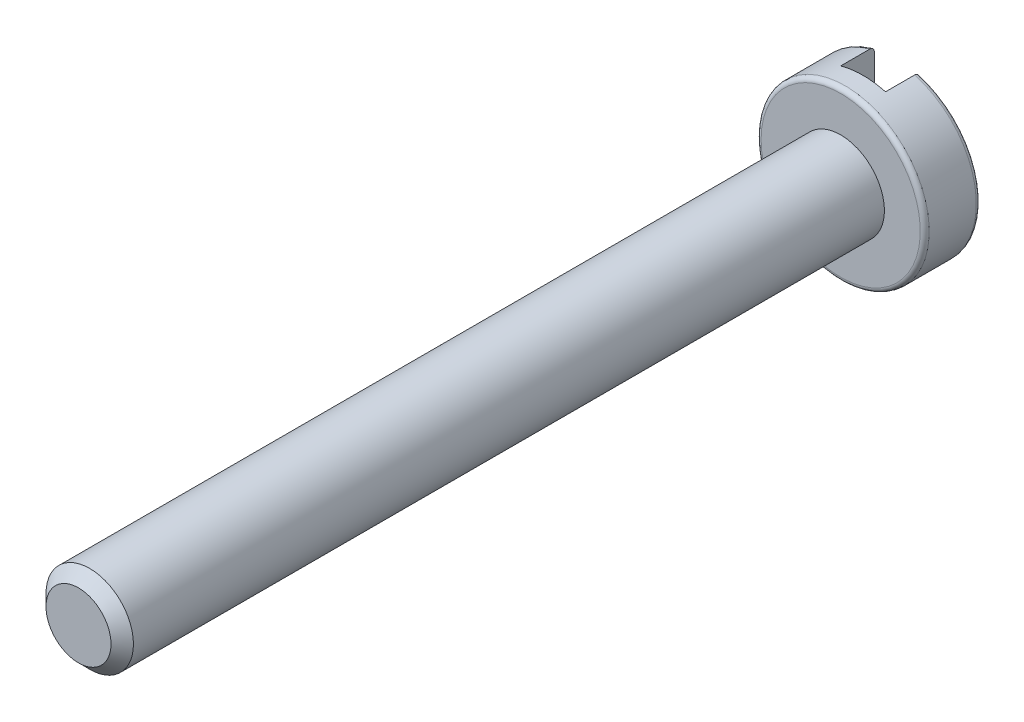
ISO-10303-21;
HEADER;
FILE_DESCRIPTION(('STEP AP214'),'2;1');
FILE_NAME('part.step','',(''),(''),'','','');
FILE_SCHEMA(('AUTOMOTIVE_DESIGN { 1 0 10303 214 1 1 1 1 }'));
ENDSEC;
DATA;
#1=APPLICATION_CONTEXT('core data for automotive mechanical design processes');
#2=APPLICATION_PROTOCOL_DEFINITION('international standard','automotive_design',2000,#1);
#3=PRODUCT_CONTEXT('',#1,'mechanical');
#4=PRODUCT('Part','Part','',(#3));
#5=PRODUCT_RELATED_PRODUCT_CATEGORY('part','',(#4));
#6=PRODUCT_DEFINITION_FORMATION('','',#4);
#7=PRODUCT_DEFINITION_CONTEXT('part definition',#1,'design');
#8=PRODUCT_DEFINITION('design','',#6,#7);
#9=PRODUCT_DEFINITION_SHAPE('','',#8);
#10=(LENGTH_UNIT() NAMED_UNIT(*) SI_UNIT(.MILLI.,.METRE.));
#11=(NAMED_UNIT(*) PLANE_ANGLE_UNIT() SI_UNIT($,.RADIAN.));
#12=(NAMED_UNIT(*) SI_UNIT($,.STERADIAN.) SOLID_ANGLE_UNIT());
#13=UNCERTAINTY_MEASURE_WITH_UNIT(LENGTH_MEASURE(1.E-05),#10,'distance_accuracy_value','');
#14=(GEOMETRIC_REPRESENTATION_CONTEXT(3) GLOBAL_UNCERTAINTY_ASSIGNED_CONTEXT((#13)) GLOBAL_UNIT_ASSIGNED_CONTEXT((#10,
#11,#12)) REPRESENTATION_CONTEXT('',''));
#15=CARTESIAN_POINT('',(0.,0.,0.));
#16=DIRECTION('',(0.,0.,1.));
#17=DIRECTION('',(1.,0.,0.));
#18=AXIS2_PLACEMENT_3D('',#15,#16,#17);
#19=CARTESIAN_POINT('',(0.,0.,-2.5));
#20=DIRECTION('',(0.,0.,-1.));
#21=DIRECTION('',(-1.,0.,0.));
#22=AXIS2_PLACEMENT_3D('',#19,#20,#21);
#23=PLANE('',#22);
#24=DIRECTION('',(0.,-1.,0.));
#25=VECTOR('',#24,1.);
#26=CARTESIAN_POINT('',(1.,0.,-2.5));
#27=LINE('',#26,#25);
#28=CARTESIAN_POINT('',(1.,3.40624426605022,-2.5));
#29=VERTEX_POINT('',#28);
#30=CARTESIAN_POINT('',(1.,-3.40624426605022,-2.5));
#31=VERTEX_POINT('',#30);
#32=EDGE_CURVE('E114',#29,#31,#27,.T.);
#33=ORIENTED_EDGE('',*,*,#32,.F.);
#34=CARTESIAN_POINT('',(0.,0.,-2.5));
#35=DIRECTION('',(0.,0.,-1.));
#36=DIRECTION('',(-1.,0.,0.));
#37=AXIS2_PLACEMENT_3D('',#34,#35,#36);
#38=CIRCLE('',#37,3.55);
#39=EDGE_CURVE('E210',#29,#31,#38,.T.);
#40=ORIENTED_EDGE('',*,*,#39,.T.);
#41=EDGE_LOOP('',(#33,#40));
#42=FACE_BOUND('',#41,.T.);
#43=ADVANCED_FACE('F34',(#42),#23,.T.);
#44=CARTESIAN_POINT('',(0.,0.,34.));
#45=DIRECTION('',(0.,0.,-1.));
#46=DIRECTION('',(-1.,0.,0.));
#47=AXIS2_PLACEMENT_3D('',#44,#45,#46);
#48=CYLINDRICAL_SURFACE('',#47,1.95);
#49=CARTESIAN_POINT('',(0.,0.,33.5));
#50=DIRECTION('',(0.,0.,1.));
#51=DIRECTION('',(1.,0.,0.));
#52=AXIS2_PLACEMENT_3D('',#49,#50,#51);
#53=CIRCLE('',#52,1.95);
#54=CARTESIAN_POINT('',(1.95,0.,33.5));
#55=VERTEX_POINT('',#54);
#56=EDGE_CURVE('E11',#55,#55,#53,.F.);
#57=ORIENTED_EDGE('',*,*,#56,.T.);
#58=EDGE_LOOP('',(#57));
#59=FACE_BOUND('',#58,.T.);
#60=CARTESIAN_POINT('',(0.,0.,0.));
#61=DIRECTION('',(0.,0.,-1.));
#62=DIRECTION('',(-1.,0.,0.));
#63=AXIS2_PLACEMENT_3D('',#60,#61,#62);
#64=CIRCLE('',#63,1.95);
#65=CARTESIAN_POINT('',(-1.95,0.,0.));
#66=VERTEX_POINT('',#65);
#67=EDGE_CURVE('E125',#66,#66,#64,.T.);
#68=ORIENTED_EDGE('',*,*,#67,.F.);
#69=EDGE_LOOP('',(#68));
#70=FACE_BOUND('',#69,.T.);
#71=ADVANCED_FACE('F190',(#59,#70),#48,.T.);
#72=CARTESIAN_POINT('',(0.,0.,34.));
#73=DIRECTION('',(0.,0.,1.));
#74=DIRECTION('',(1.,0.,0.));
#75=AXIS2_PLACEMENT_3D('',#72,#73,#74);
#76=PLANE('',#75);
#77=CARTESIAN_POINT('',(0.,0.,34.));
#78=DIRECTION('',(0.,0.,1.));
#79=DIRECTION('',(1.,0.,0.));
#80=AXIS2_PLACEMENT_3D('',#77,#78,#79);
#81=CIRCLE('',#80,1.45);
#82=CARTESIAN_POINT('',(1.45,0.,34.));
#83=VERTEX_POINT('',#82);
#84=EDGE_CURVE('E42',#83,#83,#81,.T.);
#85=ORIENTED_EDGE('',*,*,#84,.T.);
#86=EDGE_LOOP('',(#85));
#87=FACE_BOUND('',#86,.T.);
#88=ADVANCED_FACE('F195',(#87),#76,.T.);
#89=CARTESIAN_POINT('',(0.,0.,-2.5));
#90=DIRECTION('',(0.,0.,1.));
#91=DIRECTION('',(1.,0.,0.));
#92=AXIS2_PLACEMENT_3D('',#89,#90,#91);
#93=CYLINDRICAL_SURFACE('',#92,3.75);
#94=CARTESIAN_POINT('',(0.,0.,-0.2));
#95=DIRECTION('',(0.,0.,-1.));
#96=DIRECTION('',(-1.,0.,0.));
#97=AXIS2_PLACEMENT_3D('',#94,#95,#96);
#98=CIRCLE('',#97,3.75);
#99=CARTESIAN_POINT('',(-3.75,0.,-0.2));
#100=VERTEX_POINT('',#99);
#101=EDGE_CURVE('E134',#100,#100,#98,.T.);
#102=ORIENTED_EDGE('',*,*,#101,.T.);
#103=EDGE_LOOP('',(#102));
#104=FACE_BOUND('',#103,.T.);
#105=DIRECTION('',(0.,0.,1.));
#106=VECTOR('',#105,1.);
#107=CARTESIAN_POINT('',(-1.,3.61420807370024,-2.5));
#108=LINE('',#107,#106);
#109=CARTESIAN_POINT('',(-1.,3.61420807370024,-1.));
#110=VERTEX_POINT('',#109);
#111=CARTESIAN_POINT('',(-1.,3.61420807370024,-2.3));
#112=VERTEX_POINT('',#111);
#113=EDGE_CURVE('E102',#110,#112,#108,.F.);
#114=ORIENTED_EDGE('',*,*,#113,.T.);
#115=CARTESIAN_POINT('',(0.,0.,-2.3));
#116=DIRECTION('',(0.,0.,-1.));
#117=DIRECTION('',(-1.,0.,0.));
#118=AXIS2_PLACEMENT_3D('',#115,#116,#117);
#119=CIRCLE('',#118,3.75);
#120=CARTESIAN_POINT('',(-1.00000000000001,-3.61420807370024,-2.3));
#121=VERTEX_POINT('',#120);
#122=EDGE_CURVE('E97',#112,#121,#119,.F.);
#123=ORIENTED_EDGE('',*,*,#122,.T.);
#124=DIRECTION('',(0.,0.,1.));
#125=VECTOR('',#124,1.);
#126=CARTESIAN_POINT('',(-1.00000000000001,-3.61420807370024,-2.5));
#127=LINE('',#126,#125);
#128=CARTESIAN_POINT('',(-1.00000000000001,-3.61420807370024,-1.));
#129=VERTEX_POINT('',#128);
#130=EDGE_CURVE('E90',#121,#129,#127,.T.);
#131=ORIENTED_EDGE('',*,*,#130,.T.);
#132=CARTESIAN_POINT('',(0.,0.,-1.));
#133=DIRECTION('',(0.,0.,-1.));
#134=DIRECTION('',(-1.,0.,0.));
#135=AXIS2_PLACEMENT_3D('',#132,#133,#134);
#136=CIRCLE('',#135,3.75);
#137=CARTESIAN_POINT('',(1.,-3.61420807370024,-1.));
#138=VERTEX_POINT('',#137);
#139=EDGE_CURVE('E95',#138,#129,#136,.T.);
#140=ORIENTED_EDGE('',*,*,#139,.F.);
#141=DIRECTION('',(0.,0.,1.));
#142=VECTOR('',#141,1.);
#143=CARTESIAN_POINT('',(1.,-3.61420807370024,-2.5));
#144=LINE('',#143,#142);
#145=CARTESIAN_POINT('',(1.,-3.61420807370024,-2.3));
#146=VERTEX_POINT('',#145);
#147=EDGE_CURVE('E101',#138,#146,#144,.F.);
#148=ORIENTED_EDGE('',*,*,#147,.T.);
#149=CARTESIAN_POINT('',(0.,0.,-2.3));
#150=DIRECTION('',(0.,0.,-1.));
#151=DIRECTION('',(-1.,0.,0.));
#152=AXIS2_PLACEMENT_3D('',#149,#150,#151);
#153=CIRCLE('',#152,3.75);
#154=CARTESIAN_POINT('',(1.,3.61420807370024,-2.3));
#155=VERTEX_POINT('',#154);
#156=EDGE_CURVE('E131',#146,#155,#153,.F.);
#157=ORIENTED_EDGE('',*,*,#156,.T.);
#158=DIRECTION('',(0.,0.,1.));
#159=VECTOR('',#158,1.);
#160=CARTESIAN_POINT('',(1.,3.61420807370024,-2.5));
#161=LINE('',#160,#159);
#162=CARTESIAN_POINT('',(1.,3.61420807370024,-1.));
#163=VERTEX_POINT('',#162);
#164=EDGE_CURVE('E123',#155,#163,#161,.T.);
#165=ORIENTED_EDGE('',*,*,#164,.T.);
#166=EDGE_CURVE('E113',#110,#163,#136,.T.);
#167=ORIENTED_EDGE('',*,*,#166,.F.);
#168=EDGE_LOOP('',(#114,#123,#131,#140,#148,#157,#165,#167));
#169=FACE_BOUND('',#168,.T.);
#170=ADVANCED_FACE('F93',(#104,#169),#93,.T.);
#171=DIRECTION('',(0.,1.,0.));
#172=VECTOR('',#171,1.);
#173=CARTESIAN_POINT('',(-1.,0.,-2.5));
#174=LINE('',#173,#172);
#175=CARTESIAN_POINT('',(-1.,-3.40624426605022,-2.5));
#176=VERTEX_POINT('',#175);
#177=CARTESIAN_POINT('',(-1.,3.40624426605022,-2.5));
#178=VERTEX_POINT('',#177);
#179=EDGE_CURVE('E128',#176,#178,#174,.T.);
#180=ORIENTED_EDGE('',*,*,#179,.F.);
#181=CARTESIAN_POINT('',(0.,0.,-2.5));
#182=DIRECTION('',(0.,0.,-1.));
#183=DIRECTION('',(-1.,0.,0.));
#184=AXIS2_PLACEMENT_3D('',#181,#182,#183);
#185=CIRCLE('',#184,3.55);
#186=EDGE_CURVE('E140',#176,#178,#185,.T.);
#187=ORIENTED_EDGE('',*,*,#186,.T.);
#188=EDGE_LOOP('',(#180,#187));
#189=FACE_BOUND('',#188,.T.);
#190=ADVANCED_FACE('F168',(#189),#23,.T.);
#191=CARTESIAN_POINT('',(0.,0.,0.));
#192=DIRECTION('',(0.,0.,-1.));
#193=DIRECTION('',(-1.,0.,0.));
#194=AXIS2_PLACEMENT_3D('',#191,#192,#193);
#195=PLANE('',#194);
#196=CARTESIAN_POINT('',(0.,0.,0.));
#197=DIRECTION('',(0.,0.,-1.));
#198=DIRECTION('',(-1.,0.,0.));
#199=AXIS2_PLACEMENT_3D('',#196,#197,#198);
#200=CIRCLE('',#199,3.55);
#201=CARTESIAN_POINT('',(-3.55,0.,0.));
#202=VERTEX_POINT('',#201);
#203=EDGE_CURVE('E137',#202,#202,#200,.F.);
#204=ORIENTED_EDGE('',*,*,#203,.T.);
#205=EDGE_LOOP('',(#204));
#206=FACE_BOUND('',#205,.T.);
#207=ORIENTED_EDGE('',*,*,#67,.T.);
#208=EDGE_LOOP('',(#207));
#209=FACE_BOUND('',#208,.T.);
#210=ADVANCED_FACE('F199',(#206,#209),#195,.F.);
#211=CARTESIAN_POINT('',(0.,0.,-1.));
#212=DIRECTION('',(0.,0.,-1.));
#213=DIRECTION('',(-1.,0.,0.));
#214=AXIS2_PLACEMENT_3D('',#211,#212,#213);
#215=PLANE('',#214);
#216=ORIENTED_EDGE('',*,*,#166,.T.);
#217=DIRECTION('',(0.,-1.,0.));
#218=VECTOR('',#217,1.);
#219=CARTESIAN_POINT('',(1.,-5.00000000000003,-1.));
#220=LINE('',#219,#218);
#221=EDGE_CURVE('E112',#163,#138,#220,.T.);
#222=ORIENTED_EDGE('',*,*,#221,.T.);
#223=ORIENTED_EDGE('',*,*,#139,.T.);
#224=DIRECTION('',(0.,1.,0.));
#225=VECTOR('',#224,1.);
#226=CARTESIAN_POINT('',(-1.00000000000001,-5.00000000000003,-1.));
#227=LINE('',#226,#225);
#228=EDGE_CURVE('E109',#129,#110,#227,.T.);
#229=ORIENTED_EDGE('',*,*,#228,.T.);
#230=EDGE_LOOP('',(#216,#222,#223,#229));
#231=FACE_BOUND('',#230,.T.);
#232=ADVANCED_FACE('F108',(#231),#215,.T.);
#233=CARTESIAN_POINT('',(1.,-5.00000000000003,-1.));
#234=DIRECTION('',(1.,0.,0.));
#235=DIRECTION('',(0.,1.,0.));
#236=AXIS2_PLACEMENT_3D('',#233,#234,#235);
#237=PLANE('',#236);
#238=ORIENTED_EDGE('',*,*,#32,.T.);
#239=CARTESIAN_POINT('',(1.,-3.40624426605022,-2.5));
#240=CARTESIAN_POINT('',(1.,-3.41830454254019,-2.50000808686376));
#241=CARTESIAN_POINT('',(1.,-3.43036559306364,-2.49899605722499));
#242=CARTESIAN_POINT('',(1.,-3.45415844927099,-2.49498194545439));
#243=CARTESIAN_POINT('',(1.,-3.46589007266266,-2.49197878327766));
#244=CARTESIAN_POINT('',(1.,-3.48869074524513,-2.48402875218653));
#245=CARTESIAN_POINT('',(1.,-3.49975912639367,-2.47907996026292));
#246=CARTESIAN_POINT('',(1.,-3.52087707261132,-2.46735658803565));
#247=CARTESIAN_POINT('',(1.,-3.53092721782974,-2.46058305553679));
#248=CARTESIAN_POINT('',(1.,-3.54948226105507,-2.44554614542478));
#249=CARTESIAN_POINT('',(1.,-3.55801611570015,-2.4373185404797));
#250=CARTESIAN_POINT('',(1.,-3.57351748840948,-2.41949472483924));
#251=CARTESIAN_POINT('',(1.,-3.5804848438992,-2.40989837226116));
#252=CARTESIAN_POINT('',(1.,-3.59237321860439,-2.39000104852942));
#253=CARTESIAN_POINT('',(1.,-3.59736120549056,-2.37974002153165));
#254=CARTESIAN_POINT('',(1.,-3.60547400489058,-2.35851159944527));
#255=CARTESIAN_POINT('',(1.,-3.60860094341411,-2.34754502629093));
#256=CARTESIAN_POINT('',(1.,-3.61189491239189,-2.3303999351636));
#257=CARTESIAN_POINT('',(1.,-3.61276196661385,-2.32434804018341));
#258=CARTESIAN_POINT('',(1.,-3.61391824986525,-2.31219845380346));
#259=CARTESIAN_POINT('',(1.,-3.61420834143417,-2.30610084446531));
#260=CARTESIAN_POINT('',(1.,-3.61420807370039,-2.30000000000003));
#261=B_SPLINE_CURVE_WITH_KNOTS('',3,(#239,#240,#241,#242,#243,#244,#245,#246,#247,#248,#249,
#250,#251,#252,#253,#254,#255,#256,#257,#258,#259,#260),.UNSPECIFIED.,.F.,.F.,(4,2,2,2,2,2,2,2,
2,2,4),(0.,0.0361401297665336,0.0722998789862883,0.108495457762257,0.144670296407822,
0.180055004190218,0.215443382577812,0.249504048677526,0.283525729764898,0.301842419426034,
0.320131705616737),.UNSPECIFIED.);
#262=EDGE_CURVE('E49',#31,#146,#261,.T.);
#263=ORIENTED_EDGE('',*,*,#262,.T.);
#264=ORIENTED_EDGE('',*,*,#147,.F.);
#265=ORIENTED_EDGE('',*,*,#221,.F.);
#266=ORIENTED_EDGE('',*,*,#164,.F.);
#267=CARTESIAN_POINT('',(1.,3.61420807370024,-2.3));
#268=CARTESIAN_POINT('',(1.,3.61421920985478,-2.31095281792505));
#269=CARTESIAN_POINT('',(1.,3.6132752717152,-2.3219005084915));
#270=CARTESIAN_POINT('',(1.,3.60956214194044,-2.34346275264335));
#271=CARTESIAN_POINT('',(1.,3.60679617363441,-2.35407785992033));
#272=CARTESIAN_POINT('',(1.,3.59952281849436,-2.37469431469834));
#273=CARTESIAN_POINT('',(1.,3.59501518342093,-2.38469557447223));
#274=CARTESIAN_POINT('',(1.,3.58440965344715,-2.40381509194197));
#275=CARTESIAN_POINT('',(1.,3.57831160256568,-2.41293326290794));
#276=CARTESIAN_POINT('',(1.,3.56461235388086,-2.43018344969231));
#277=CARTESIAN_POINT('',(1.,3.55699003325195,-2.43829867149073));
#278=CARTESIAN_POINT('',(1.,3.5405309259563,-2.45318689682283));
#279=CARTESIAN_POINT('',(1.,3.5316938630268,-2.45995959417482));
#280=CARTESIAN_POINT('',(1.,3.51273333783286,-2.47222020729629));
#281=CARTESIAN_POINT('',(1.,3.50257597786071,-2.47765564555464));
#282=CARTESIAN_POINT('',(1.,3.48151547066233,-2.48681122258167));
#283=CARTESIAN_POINT('',(1.,3.4706123353636,-2.49053138877604));
#284=CARTESIAN_POINT('',(1.,3.45078900988793,-2.4955662451963));
#285=CARTESIAN_POINT('',(1.,3.44195517385067,-2.49722866627935));
#286=CARTESIAN_POINT('',(1.,3.42416291609406,-2.49944556629917));
#287=CARTESIAN_POINT('',(1.,3.41520470058309,-2.50000169941992));
#288=CARTESIAN_POINT('',(1.,3.40624426605022,-2.5));
#289=B_SPLINE_CURVE_WITH_KNOTS('',3,(#267,#268,#269,#270,#271,#272,#273,#274,#275,#276,#277,
#278,#279,#280,#281,#282,#283,#284,#285,#286,#287,#288),.UNSPECIFIED.,.F.,.F.,(4,2,2,2,2,2,2,2,
2,2,4),(0.,0.0328100745428368,0.0655622605455491,0.09831911643362,0.131079186181607,
0.164329359004093,0.197587106296535,0.231993979374045,0.2664003022967,0.293300145422802,
0.320159736066206),.UNSPECIFIED.);
#290=EDGE_CURVE('E57',#155,#29,#289,.T.);
#291=ORIENTED_EDGE('',*,*,#290,.T.);
#292=EDGE_LOOP('',(#238,#263,#264,#265,#266,#291));
#293=FACE_BOUND('',#292,.T.);
#294=ADVANCED_FACE('F163',(#293),#237,.F.);
#295=CARTESIAN_POINT('',(-1.00000000000001,-5.00000000000003,-1.));
#296=DIRECTION('',(-1.,0.,0.));
#297=DIRECTION('',(0.,-1.,0.));
#298=AXIS2_PLACEMENT_3D('',#295,#296,#297);
#299=PLANE('',#298);
#300=ORIENTED_EDGE('',*,*,#179,.T.);
#301=CARTESIAN_POINT('',(-1.,3.40624426605022,-2.5));
#302=CARTESIAN_POINT('',(-1.,3.41830454254019,-2.50000808686376));
#303=CARTESIAN_POINT('',(-1.,3.43036559306364,-2.49899605722499));
#304=CARTESIAN_POINT('',(-1.,3.45415844927099,-2.49498194545439));
#305=CARTESIAN_POINT('',(-1.,3.46589007266266,-2.49197878327766));
#306=CARTESIAN_POINT('',(-1.,3.48869074524513,-2.48402875218653));
#307=CARTESIAN_POINT('',(-1.,3.49975912639367,-2.47907996026292));
#308=CARTESIAN_POINT('',(-1.,3.52087707261132,-2.46735658803565));
#309=CARTESIAN_POINT('',(-1.,3.53092721782974,-2.4605830555368));
#310=CARTESIAN_POINT('',(-1.,3.54948226105507,-2.44554614542479));
#311=CARTESIAN_POINT('',(-1.,3.55801611570015,-2.4373185404797));
#312=CARTESIAN_POINT('',(-1.,3.57351748840948,-2.41949472483924));
#313=CARTESIAN_POINT('',(-1.,3.5804848438992,-2.40989837226116));
#314=CARTESIAN_POINT('',(-1.,3.59237321860439,-2.39000104852942));
#315=CARTESIAN_POINT('',(-1.,3.59736120549056,-2.37974002153165));
#316=CARTESIAN_POINT('',(-1.,3.60547400489058,-2.35851159944527));
#317=CARTESIAN_POINT('',(-1.,3.60860094341411,-2.34754502629093));
#318=CARTESIAN_POINT('',(-1.,3.61189491239189,-2.3303999351636));
#319=CARTESIAN_POINT('',(-1.,3.61276196661385,-2.32434804018341));
#320=CARTESIAN_POINT('',(-1.,3.61391824986525,-2.31219845380346));
#321=CARTESIAN_POINT('',(-1.,3.61420834143417,-2.30610084446531));
#322=CARTESIAN_POINT('',(-1.,3.61420807370039,-2.30000000000003));
#323=B_SPLINE_CURVE_WITH_KNOTS('',3,(#301,#302,#303,#304,#305,#306,#307,#308,#309,#310,#311,
#312,#313,#314,#315,#316,#317,#318,#319,#320,#321,#322),.UNSPECIFIED.,.F.,.F.,(4,2,2,2,2,2,2,2,
2,2,4),(0.,0.0361401297665336,0.0722998789862879,0.108495457762256,0.144670296407821,
0.180055004190217,0.215443382577811,0.249504048677524,0.283525729764896,0.301842419426033,
0.320131705616737),.UNSPECIFIED.);
#324=EDGE_CURVE('E150',#178,#112,#323,.T.);
#325=ORIENTED_EDGE('',*,*,#324,.T.);
#326=ORIENTED_EDGE('',*,*,#113,.F.);
#327=ORIENTED_EDGE('',*,*,#228,.F.);
#328=ORIENTED_EDGE('',*,*,#130,.F.);
#329=CARTESIAN_POINT('',(-1.,-3.61420807370024,-2.3));
#330=CARTESIAN_POINT('',(-1.00000000000001,-3.61421920985478,-2.31095281792505));
#331=CARTESIAN_POINT('',(-1.00000000000001,-3.6132752717152,-2.3219005084915));
#332=CARTESIAN_POINT('',(-1.00000000000001,-3.60956214194044,-2.34346275264335));
#333=CARTESIAN_POINT('',(-1.00000000000001,-3.60679617363441,-2.35407785992033));
#334=CARTESIAN_POINT('',(-1.00000000000001,-3.59952281849436,-2.37469431469834));
#335=CARTESIAN_POINT('',(-1.00000000000001,-3.59501518342093,-2.38469557447223));
#336=CARTESIAN_POINT('',(-1.00000000000001,-3.58440965344714,-2.40381509194197));
#337=CARTESIAN_POINT('',(-1.00000000000001,-3.57831160256567,-2.41293326290794));
#338=CARTESIAN_POINT('',(-1.00000000000001,-3.56461235388085,-2.43018344969231));
#339=CARTESIAN_POINT('',(-1.00000000000001,-3.55699003325195,-2.43829867149073));
#340=CARTESIAN_POINT('',(-1.00000000000001,-3.5405309259563,-2.45318689682283));
#341=CARTESIAN_POINT('',(-1.00000000000001,-3.5316938630268,-2.45995959417482));
#342=CARTESIAN_POINT('',(-1.00000000000001,-3.51273333783286,-2.47222020729629));
#343=CARTESIAN_POINT('',(-1.00000000000001,-3.50257597786071,-2.47765564555464));
#344=CARTESIAN_POINT('',(-1.00000000000001,-3.48151547066233,-2.48681122258167));
#345=CARTESIAN_POINT('',(-1.00000000000001,-3.4706123353636,-2.49053138877604));
#346=CARTESIAN_POINT('',(-1.00000000000001,-3.45078900988793,-2.4955662451963));
#347=CARTESIAN_POINT('',(-1.00000000000001,-3.44195517385067,-2.49722866627935));
#348=CARTESIAN_POINT('',(-1.00000000000001,-3.42416291609406,-2.49944556629917));
#349=CARTESIAN_POINT('',(-1.00000000000001,-3.41520470058309,-2.50000169941992));
#350=CARTESIAN_POINT('',(-1.00000000000001,-3.40624426605022,-2.5));
#351=B_SPLINE_CURVE_WITH_KNOTS('',3,(#329,#330,#331,#332,#333,#334,#335,#336,#337,#338,#339,
#340,#341,#342,#343,#344,#345,#346,#347,#348,#349,#350),.UNSPECIFIED.,.F.,.F.,(4,2,2,2,2,2,2,2,
2,2,4),(0.,0.0328100745428372,0.0655622605455492,0.0983191164336199,0.131079186181607,
0.164329359004094,0.197587106296535,0.231993979374045,0.2664003022967,0.293300145422802,
0.320159736066206),.UNSPECIFIED.);
#352=EDGE_CURVE('E143',#121,#176,#351,.T.);
#353=ORIENTED_EDGE('',*,*,#352,.T.);
#354=EDGE_LOOP('',(#300,#325,#326,#327,#328,#353));
#355=FACE_BOUND('',#354,.T.);
#356=ADVANCED_FACE('F117',(#355),#299,.F.);
#357=CARTESIAN_POINT('',(0.,0.,-0.2));
#358=DIRECTION('',(0.,0.,-1.));
#359=DIRECTION('',(-1.,0.,0.));
#360=AXIS2_PLACEMENT_3D('',#357,#358,#359);
#361=TOROIDAL_SURFACE('',#360,3.55,0.2);
#362=ORIENTED_EDGE('',*,*,#203,.F.);
#363=EDGE_LOOP('',(#362));
#364=FACE_BOUND('',#363,.T.);
#365=ORIENTED_EDGE('',*,*,#101,.F.);
#366=EDGE_LOOP('',(#365));
#367=FACE_BOUND('',#366,.T.);
#368=ADVANCED_FACE('F162',(#364,#367),#361,.T.);
#369=CARTESIAN_POINT('',(0.,0.,-2.3));
#370=DIRECTION('',(0.,0.,-1.));
#371=DIRECTION('',(-1.,0.,0.));
#372=AXIS2_PLACEMENT_3D('',#369,#370,#371);
#373=TOROIDAL_SURFACE('',#372,3.55,0.2);
#374=ORIENTED_EDGE('',*,*,#352,.F.);
#375=ORIENTED_EDGE('',*,*,#122,.F.);
#376=ORIENTED_EDGE('',*,*,#324,.F.);
#377=ORIENTED_EDGE('',*,*,#186,.F.);
#378=EDGE_LOOP('',(#374,#375,#376,#377));
#379=FACE_BOUND('',#378,.T.);
#380=ADVANCED_FACE('F155',(#379),#373,.T.);
#381=CARTESIAN_POINT('',(0.,0.,-2.3));
#382=DIRECTION('',(0.,0.,-1.));
#383=DIRECTION('',(-1.,0.,0.));
#384=AXIS2_PLACEMENT_3D('',#381,#382,#383);
#385=TOROIDAL_SURFACE('',#384,3.55,0.2);
#386=ORIENTED_EDGE('',*,*,#290,.F.);
#387=ORIENTED_EDGE('',*,*,#156,.F.);
#388=ORIENTED_EDGE('',*,*,#262,.F.);
#389=ORIENTED_EDGE('',*,*,#39,.F.);
#390=EDGE_LOOP('',(#386,#387,#388,#389));
#391=FACE_BOUND('',#390,.T.);
#392=ADVANCED_FACE('F179',(#391),#385,.T.);
#393=CARTESIAN_POINT('',(0.,0.,34.));
#394=DIRECTION('',(0.,0.,-1.));
#395=DIRECTION('',(-1.,0.,0.));
#396=AXIS2_PLACEMENT_3D('',#393,#394,#395);
#397=CONICAL_SURFACE('',#396,1.45,0.785398163397448);
#398=ORIENTED_EDGE('',*,*,#56,.F.);
#399=EDGE_LOOP('',(#398));
#400=FACE_BOUND('',#399,.T.);
#401=ORIENTED_EDGE('',*,*,#84,.F.);
#402=EDGE_LOOP('',(#401));
#403=FACE_BOUND('',#402,.T.);
#404=ADVANCED_FACE('F36',(#400,#403),#397,.T.);
#405=CLOSED_SHELL('',(#43,#71,#88,#170,#190,#210,#232,#294,#356,#368,#380,#392,#404));
#406=MANIFOLD_SOLID_BREP('B2',#405);
#407=ADVANCED_BREP_SHAPE_REPRESENTATION('',(#18,#406),#14);
#408=SHAPE_DEFINITION_REPRESENTATION(#9,#407);
ENDSEC;
END-ISO-10303-21;
